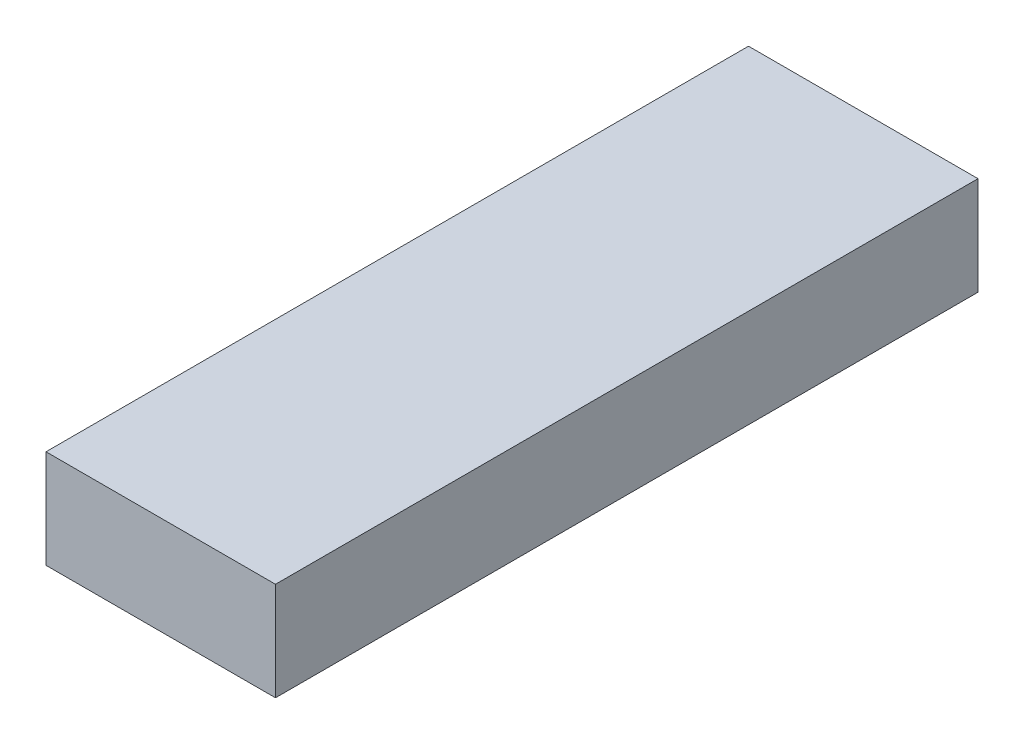
ISO-10303-21;
HEADER;
FILE_DESCRIPTION(('STEP AP214'),'2;1');
FILE_NAME('part.step','',(''),(''),'','','');
FILE_SCHEMA(('AUTOMOTIVE_DESIGN { 1 0 10303 214 1 1 1 1 }'));
ENDSEC;
DATA;
#1=APPLICATION_CONTEXT('core data for automotive mechanical design processes');
#2=APPLICATION_PROTOCOL_DEFINITION('international standard','automotive_design',2000,#1);
#3=PRODUCT_CONTEXT('',#1,'mechanical');
#4=PRODUCT('Part','Part','',(#3));
#5=PRODUCT_RELATED_PRODUCT_CATEGORY('part','',(#4));
#6=PRODUCT_DEFINITION_FORMATION('','',#4);
#7=PRODUCT_DEFINITION_CONTEXT('part definition',#1,'design');
#8=PRODUCT_DEFINITION('design','',#6,#7);
#9=PRODUCT_DEFINITION_SHAPE('','',#8);
#10=(LENGTH_UNIT() NAMED_UNIT(*) SI_UNIT(.MILLI.,.METRE.));
#11=(NAMED_UNIT(*) PLANE_ANGLE_UNIT() SI_UNIT($,.RADIAN.));
#12=(NAMED_UNIT(*) SI_UNIT($,.STERADIAN.) SOLID_ANGLE_UNIT());
#13=UNCERTAINTY_MEASURE_WITH_UNIT(LENGTH_MEASURE(1.E-05),#10,'distance_accuracy_value','');
#14=(GEOMETRIC_REPRESENTATION_CONTEXT(3) GLOBAL_UNCERTAINTY_ASSIGNED_CONTEXT((#13)) GLOBAL_UNIT_ASSIGNED_CONTEXT((#10,
#11,#12)) REPRESENTATION_CONTEXT('',''));
#15=CARTESIAN_POINT('',(0.,0.,0.));
#16=DIRECTION('',(0.,0.,1.));
#17=DIRECTION('',(1.,0.,0.));
#18=AXIS2_PLACEMENT_3D('',#15,#16,#17);
#19=CARTESIAN_POINT('',(49.,42.,-150.));
#20=DIRECTION('',(-1.,0.,0.));
#21=DIRECTION('',(0.,0.,1.));
#22=AXIS2_PLACEMENT_3D('',#19,#20,#21);
#23=PLANE('',#22);
#24=DIRECTION('',(0.,0.,-1.));
#25=VECTOR('',#24,1.);
#26=CARTESIAN_POINT('',(49.,0.,-150.));
#27=LINE('',#26,#25);
#28=CARTESIAN_POINT('',(49.,0.,150.));
#29=VERTEX_POINT('',#28);
#30=CARTESIAN_POINT('',(49.,0.,-150.));
#31=VERTEX_POINT('',#30);
#32=EDGE_CURVE('E101',#29,#31,#27,.T.);
#33=ORIENTED_EDGE('',*,*,#32,.T.);
#34=DIRECTION('',(0.,-1.,0.));
#35=VECTOR('',#34,1.);
#36=CARTESIAN_POINT('',(49.,42.,-150.));
#37=LINE('',#36,#35);
#38=CARTESIAN_POINT('',(49.,42.,-150.));
#39=VERTEX_POINT('',#38);
#40=EDGE_CURVE('E11',#39,#31,#37,.T.);
#41=ORIENTED_EDGE('',*,*,#40,.F.);
#42=DIRECTION('',(0.,0.,-1.));
#43=VECTOR('',#42,1.);
#44=CARTESIAN_POINT('',(49.,42.,-150.));
#45=LINE('',#44,#43);
#46=CARTESIAN_POINT('',(49.,42.,150.));
#47=VERTEX_POINT('',#46);
#48=EDGE_CURVE('E89',#47,#39,#45,.T.);
#49=ORIENTED_EDGE('',*,*,#48,.F.);
#50=DIRECTION('',(0.,-1.,0.));
#51=VECTOR('',#50,1.);
#52=CARTESIAN_POINT('',(49.,42.,150.));
#53=LINE('',#52,#51);
#54=EDGE_CURVE('E97',#47,#29,#53,.T.);
#55=ORIENTED_EDGE('',*,*,#54,.T.);
#56=EDGE_LOOP('',(#33,#41,#49,#55));
#57=FACE_BOUND('',#56,.T.);
#58=ADVANCED_FACE('F38',(#57),#23,.F.);
#59=CARTESIAN_POINT('',(-49.,42.,-150.));
#60=DIRECTION('',(0.,0.,1.));
#61=DIRECTION('',(1.,0.,0.));
#62=AXIS2_PLACEMENT_3D('',#59,#60,#61);
#63=PLANE('',#62);
#64=DIRECTION('',(-1.,0.,0.));
#65=VECTOR('',#64,1.);
#66=CARTESIAN_POINT('',(-49.,0.,-150.));
#67=LINE('',#66,#65);
#68=CARTESIAN_POINT('',(-49.,0.,-150.));
#69=VERTEX_POINT('',#68);
#70=EDGE_CURVE('E93',#31,#69,#67,.T.);
#71=ORIENTED_EDGE('',*,*,#70,.T.);
#72=DIRECTION('',(0.,-1.,0.));
#73=VECTOR('',#72,1.);
#74=CARTESIAN_POINT('',(-49.,42.,-150.));
#75=LINE('',#74,#73);
#76=CARTESIAN_POINT('',(-49.,42.,-150.));
#77=VERTEX_POINT('',#76);
#78=EDGE_CURVE('E46',#77,#69,#75,.T.);
#79=ORIENTED_EDGE('',*,*,#78,.F.);
#80=DIRECTION('',(-1.,0.,0.));
#81=VECTOR('',#80,1.);
#82=CARTESIAN_POINT('',(-49.,42.,-150.));
#83=LINE('',#82,#81);
#84=EDGE_CURVE('E84',#39,#77,#83,.T.);
#85=ORIENTED_EDGE('',*,*,#84,.F.);
#86=ORIENTED_EDGE('',*,*,#40,.T.);
#87=EDGE_LOOP('',(#71,#79,#85,#86));
#88=FACE_BOUND('',#87,.T.);
#89=ADVANCED_FACE('F92',(#88),#63,.F.);
#90=CARTESIAN_POINT('',(-49.,42.,-150.));
#91=DIRECTION('',(1.,0.,0.));
#92=DIRECTION('',(0.,0.,-1.));
#93=AXIS2_PLACEMENT_3D('',#90,#91,#92);
#94=PLANE('',#93);
#95=DIRECTION('',(0.,0.,1.));
#96=VECTOR('',#95,1.);
#97=CARTESIAN_POINT('',(-49.,0.,-150.));
#98=LINE('',#97,#96);
#99=CARTESIAN_POINT('',(-49.,0.,150.));
#100=VERTEX_POINT('',#99);
#101=EDGE_CURVE('E71',#69,#100,#98,.T.);
#102=ORIENTED_EDGE('',*,*,#101,.T.);
#103=DIRECTION('',(0.,-1.,0.));
#104=VECTOR('',#103,1.);
#105=CARTESIAN_POINT('',(-49.,42.,150.));
#106=LINE('',#105,#104);
#107=CARTESIAN_POINT('',(-49.,42.,150.));
#108=VERTEX_POINT('',#107);
#109=EDGE_CURVE('E94',#108,#100,#106,.T.);
#110=ORIENTED_EDGE('',*,*,#109,.F.);
#111=DIRECTION('',(0.,0.,1.));
#112=VECTOR('',#111,1.);
#113=CARTESIAN_POINT('',(-49.,42.,-150.));
#114=LINE('',#113,#112);
#115=EDGE_CURVE('E87',#77,#108,#114,.T.);
#116=ORIENTED_EDGE('',*,*,#115,.F.);
#117=ORIENTED_EDGE('',*,*,#78,.T.);
#118=EDGE_LOOP('',(#102,#110,#116,#117));
#119=FACE_BOUND('',#118,.T.);
#120=ADVANCED_FACE('F95',(#119),#94,.F.);
#121=CARTESIAN_POINT('',(-49.,42.,150.));
#122=DIRECTION('',(0.,0.,-1.));
#123=DIRECTION('',(-1.,0.,0.));
#124=AXIS2_PLACEMENT_3D('',#121,#122,#123);
#125=PLANE('',#124);
#126=DIRECTION('',(1.,0.,0.));
#127=VECTOR('',#126,1.);
#128=CARTESIAN_POINT('',(-49.,0.,150.));
#129=LINE('',#128,#127);
#130=EDGE_CURVE('E77',#100,#29,#129,.T.);
#131=ORIENTED_EDGE('',*,*,#130,.T.);
#132=ORIENTED_EDGE('',*,*,#54,.F.);
#133=DIRECTION('',(1.,0.,0.));
#134=VECTOR('',#133,1.);
#135=CARTESIAN_POINT('',(-49.,42.,150.));
#136=LINE('',#135,#134);
#137=EDGE_CURVE('E54',#108,#47,#136,.T.);
#138=ORIENTED_EDGE('',*,*,#137,.F.);
#139=ORIENTED_EDGE('',*,*,#109,.T.);
#140=EDGE_LOOP('',(#131,#132,#138,#139));
#141=FACE_BOUND('',#140,.T.);
#142=ADVANCED_FACE('F108',(#141),#125,.F.);
#143=CARTESIAN_POINT('',(0.,42.,0.));
#144=DIRECTION('',(0.,1.,0.));
#145=DIRECTION('',(0.,0.,1.));
#146=AXIS2_PLACEMENT_3D('',#143,#144,#145);
#147=PLANE('',#146);
#148=ORIENTED_EDGE('',*,*,#48,.T.);
#149=ORIENTED_EDGE('',*,*,#84,.T.);
#150=ORIENTED_EDGE('',*,*,#115,.T.);
#151=ORIENTED_EDGE('',*,*,#137,.T.);
#152=EDGE_LOOP('',(#148,#149,#150,#151));
#153=FACE_BOUND('',#152,.T.);
#154=ADVANCED_FACE('F85',(#153),#147,.T.);
#155=CARTESIAN_POINT('',(0.,0.,0.));
#156=DIRECTION('',(0.,1.,0.));
#157=DIRECTION('',(0.,0.,1.));
#158=AXIS2_PLACEMENT_3D('',#155,#156,#157);
#159=PLANE('',#158);
#160=ORIENTED_EDGE('',*,*,#32,.F.);
#161=ORIENTED_EDGE('',*,*,#130,.F.);
#162=ORIENTED_EDGE('',*,*,#101,.F.);
#163=ORIENTED_EDGE('',*,*,#70,.F.);
#164=EDGE_LOOP('',(#160,#161,#162,#163));
#165=FACE_BOUND('',#164,.T.);
#166=ADVANCED_FACE('F111',(#165),#159,.F.);
#167=CLOSED_SHELL('',(#58,#89,#120,#142,#154,#166));
#168=MANIFOLD_SOLID_BREP('B2',#167);
#169=ADVANCED_BREP_SHAPE_REPRESENTATION('',(#18,#168),#14);
#170=SHAPE_DEFINITION_REPRESENTATION(#9,#169);
ENDSEC;
END-ISO-10303-21;
